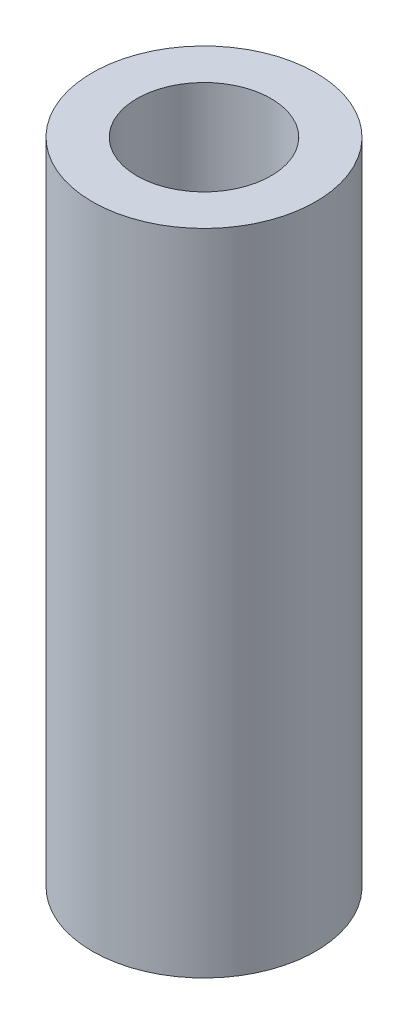
ISO-10303-21;
HEADER;
FILE_DESCRIPTION(('STEP AP214'),'2;1');
FILE_NAME('part.step','',(''),(''),'','','');
FILE_SCHEMA(('AUTOMOTIVE_DESIGN { 1 0 10303 214 1 1 1 1 }'));
ENDSEC;
DATA;
#1=APPLICATION_CONTEXT('core data for automotive mechanical design processes');
#2=APPLICATION_PROTOCOL_DEFINITION('international standard','automotive_design',2000,#1);
#3=PRODUCT_CONTEXT('',#1,'mechanical');
#4=PRODUCT('Part','Part','',(#3));
#5=PRODUCT_RELATED_PRODUCT_CATEGORY('part','',(#4));
#6=PRODUCT_DEFINITION_FORMATION('','',#4);
#7=PRODUCT_DEFINITION_CONTEXT('part definition',#1,'design');
#8=PRODUCT_DEFINITION('design','',#6,#7);
#9=PRODUCT_DEFINITION_SHAPE('','',#8);
#10=(LENGTH_UNIT() NAMED_UNIT(*) SI_UNIT(.MILLI.,.METRE.));
#11=(NAMED_UNIT(*) PLANE_ANGLE_UNIT() SI_UNIT($,.RADIAN.));
#12=(NAMED_UNIT(*) SI_UNIT($,.STERADIAN.) SOLID_ANGLE_UNIT());
#13=UNCERTAINTY_MEASURE_WITH_UNIT(LENGTH_MEASURE(1.E-05),#10,'distance_accuracy_value','');
#14=(GEOMETRIC_REPRESENTATION_CONTEXT(3) GLOBAL_UNCERTAINTY_ASSIGNED_CONTEXT((#13)) GLOBAL_UNIT_ASSIGNED_CONTEXT((#10,
#11,#12)) REPRESENTATION_CONTEXT('',''));
#15=CARTESIAN_POINT('',(0.,0.,0.));
#16=DIRECTION('',(0.,0.,1.));
#17=DIRECTION('',(1.,0.,0.));
#18=AXIS2_PLACEMENT_3D('',#15,#16,#17);
#19=CARTESIAN_POINT('',(0.,30.5,0.));
#20=DIRECTION('',(0.,-1.,0.));
#21=DIRECTION('',(0.,0.,-1.));
#22=AXIS2_PLACEMENT_3D('',#19,#20,#21);
#23=CYLINDRICAL_SURFACE('',#22,5.25);
#24=CARTESIAN_POINT('',(0.,30.5,0.));
#25=DIRECTION('',(0.,1.,0.));
#26=DIRECTION('',(0.,0.,1.));
#27=AXIS2_PLACEMENT_3D('',#24,#25,#26);
#28=CIRCLE('',#27,5.25);
#29=CARTESIAN_POINT('',(0.,30.5,-5.25));
#30=VERTEX_POINT('',#29);
#31=EDGE_CURVE('E10',#30,#30,#28,.T.);
#32=CARTESIAN_POINT('',(0.,0.,0.));
#33=DIRECTION('',(0.,1.,0.));
#34=DIRECTION('',(0.,0.,1.));
#35=AXIS2_PLACEMENT_3D('',#32,#33,#34);
#36=CIRCLE('',#35,5.25);
#37=CARTESIAN_POINT('',(0.,0.,-5.25));
#38=VERTEX_POINT('',#37);
#39=EDGE_CURVE('E44',#38,#38,#36,.T.);
#40=CARTESIAN_POINT('',(0.,30.5,-5.25));
#41=CARTESIAN_POINT('',(0.,30.1822916666667,-5.25));
#42=CARTESIAN_POINT('',(0.,29.8645833333333,-5.25));
#43=CARTESIAN_POINT('',(0.,29.2291666666667,-5.25));
#44=CARTESIAN_POINT('',(0.,28.9114583333333,-5.25));
#45=CARTESIAN_POINT('',(0.,28.2760416666667,-5.25));
#46=CARTESIAN_POINT('',(0.,27.9583333333333,-5.25));
#47=CARTESIAN_POINT('',(0.,27.3229166666667,-5.25));
#48=CARTESIAN_POINT('',(0.,27.0052083333333,-5.25));
#49=CARTESIAN_POINT('',(0.,26.3697916666667,-5.25));
#50=CARTESIAN_POINT('',(0.,26.0520833333333,-5.25));
#51=CARTESIAN_POINT('',(0.,25.4166666666667,-5.25));
#52=CARTESIAN_POINT('',(0.,25.0989583333333,-5.25));
#53=CARTESIAN_POINT('',(0.,24.4635416666667,-5.25));
#54=CARTESIAN_POINT('',(0.,24.1458333333333,-5.25));
#55=CARTESIAN_POINT('',(0.,23.5104166666667,-5.25));
#56=CARTESIAN_POINT('',(0.,23.1927083333333,-5.25));
#57=CARTESIAN_POINT('',(0.,22.5572916666667,-5.25));
#58=CARTESIAN_POINT('',(0.,22.2395833333333,-5.25));
#59=CARTESIAN_POINT('',(0.,21.6041666666667,-5.25));
#60=CARTESIAN_POINT('',(0.,21.2864583333333,-5.25));
#61=CARTESIAN_POINT('',(0.,20.6510416666667,-5.25));
#62=CARTESIAN_POINT('',(0.,20.3333333333333,-5.25));
#63=CARTESIAN_POINT('',(0.,19.6979166666667,-5.25));
#64=CARTESIAN_POINT('',(0.,19.3802083333333,-5.25));
#65=CARTESIAN_POINT('',(0.,18.7447916666667,-5.25));
#66=CARTESIAN_POINT('',(0.,18.4270833333333,-5.25));
#67=CARTESIAN_POINT('',(0.,17.7916666666667,-5.25));
#68=CARTESIAN_POINT('',(0.,17.4739583333333,-5.25));
#69=CARTESIAN_POINT('',(0.,16.8385416666667,-5.25));
#70=CARTESIAN_POINT('',(0.,16.5208333333333,-5.25));
#71=CARTESIAN_POINT('',(0.,15.8854166666667,-5.25));
#72=CARTESIAN_POINT('',(0.,15.5677083333333,-5.25));
#73=CARTESIAN_POINT('',(0.,14.9322916666667,-5.25));
#74=CARTESIAN_POINT('',(0.,14.6145833333333,-5.25));
#75=CARTESIAN_POINT('',(0.,13.9791666666667,-5.25));
#76=CARTESIAN_POINT('',(0.,13.6614583333333,-5.25));
#77=CARTESIAN_POINT('',(0.,13.0260416666667,-5.25));
#78=CARTESIAN_POINT('',(0.,12.7083333333333,-5.25));
#79=CARTESIAN_POINT('',(0.,12.0729166666667,-5.25));
#80=CARTESIAN_POINT('',(0.,11.7552083333333,-5.25));
#81=CARTESIAN_POINT('',(0.,11.1197916666667,-5.25));
#82=CARTESIAN_POINT('',(0.,10.8020833333333,-5.25));
#83=CARTESIAN_POINT('',(0.,10.1666666666667,-5.25));
#84=CARTESIAN_POINT('',(0.,9.84895833333333,-5.25));
#85=CARTESIAN_POINT('',(0.,9.21354166666666,-5.25));
#86=CARTESIAN_POINT('',(0.,8.89583333333333,-5.25));
#87=CARTESIAN_POINT('',(0.,8.26041666666666,-5.25));
#88=CARTESIAN_POINT('',(0.,7.94270833333333,-5.25));
#89=CARTESIAN_POINT('',(0.,7.30729166666666,-5.25));
#90=CARTESIAN_POINT('',(0.,6.98958333333333,-5.25));
#91=CARTESIAN_POINT('',(0.,6.35416666666666,-5.25));
#92=CARTESIAN_POINT('',(0.,6.03645833333333,-5.25));
#93=CARTESIAN_POINT('',(0.,5.40104166666666,-5.25));
#94=CARTESIAN_POINT('',(0.,5.08333333333333,-5.25));
#95=CARTESIAN_POINT('',(0.,4.44791666666666,-5.25));
#96=CARTESIAN_POINT('',(0.,4.13020833333333,-5.25));
#97=CARTESIAN_POINT('',(0.,3.49479166666666,-5.25));
#98=CARTESIAN_POINT('',(0.,3.17708333333333,-5.25));
#99=CARTESIAN_POINT('',(0.,2.54166666666666,-5.25));
#100=CARTESIAN_POINT('',(0.,2.22395833333333,-5.25));
#101=CARTESIAN_POINT('',(0.,1.58854166666666,-5.25));
#102=CARTESIAN_POINT('',(0.,1.27083333333333,-5.25));
#103=CARTESIAN_POINT('',(0.,0.635416666666662,-5.25));
#104=CARTESIAN_POINT('',(0.,0.317708333333329,-5.25));
#105=CARTESIAN_POINT('',(0.,0.,-5.25));
#106=B_SPLINE_CURVE_WITH_KNOTS('',3,(#40,#41,#42,#43,#44,#45,#46,#47,#48,#49,#50,#51,#52,#53,
#54,#55,#56,#57,#58,#59,#60,#61,#62,#63,#64,#65,#66,#67,#68,#69,#70,#71,#72,#73,#74,#75,#76,#77,
#78,#79,#80,#81,#82,#83,#84,#85,#86,#87,#88,#89,#90,#91,#92,#93,#94,#95,#96,#97,#98,#99,#100,
#101,#102,#103,#104,#105),.UNSPECIFIED.,.F.,.F.,(4,2,2,2,2,2,2,2,2,2,2,2,2,2,2,2,2,2,2,2,2,2,2,
2,2,2,2,2,2,2,2,2,4),(0.,0.953124999999999,1.90625,2.859375,3.8125,4.765625,5.71875,6.671875,
7.625,8.57812499999999,9.53125,10.484375,11.4375,12.390625,13.34375,14.296875,15.25,16.203125,
17.15625,18.109375,19.0625,20.015625,20.96875,21.921875,22.875,23.828125,24.78125,25.734375,
26.6875,27.640625,28.59375,29.546875,30.5),.UNSPECIFIED.);
#107=EDGE_CURVE('BSEAM41',#30,#38,#106,.T.);
#108=ORIENTED_EDGE('',*,*,#31,.F.);
#109=ORIENTED_EDGE('',*,*,#39,.T.);
#110=ORIENTED_EDGE('',*,*,#107,.T.);
#111=ORIENTED_EDGE('',*,*,#107,.F.);
#112=EDGE_LOOP('',(#108,#110,#109,#111));
#113=FACE_BOUND('',#112,.T.);
#114=ADVANCED_FACE('F41',(#113),#23,.T.);
#115=CARTESIAN_POINT('',(0.,30.5,0.));
#116=DIRECTION('',(0.,1.,0.));
#117=DIRECTION('',(0.,0.,1.));
#118=AXIS2_PLACEMENT_3D('',#115,#116,#117);
#119=PLANE('',#118);
#120=CARTESIAN_POINT('',(0.,30.5,0.));
#121=DIRECTION('',(0.,1.,0.));
#122=DIRECTION('',(0.,0.,1.));
#123=AXIS2_PLACEMENT_3D('',#120,#121,#122);
#124=CIRCLE('',#123,3.15);
#125=CARTESIAN_POINT('',(0.,30.5,3.15));
#126=VERTEX_POINT('',#125);
#127=EDGE_CURVE('E55',#126,#126,#124,.T.);
#128=ORIENTED_EDGE('',*,*,#127,.F.);
#129=EDGE_LOOP('',(#128));
#130=FACE_BOUND('',#129,.T.);
#131=ORIENTED_EDGE('',*,*,#31,.T.);
#132=EDGE_LOOP('',(#131));
#133=FACE_BOUND('',#132,.T.);
#134=ADVANCED_FACE('F72',(#130,#133),#119,.T.);
#135=CARTESIAN_POINT('',(0.,0.,0.));
#136=DIRECTION('',(0.,1.,0.));
#137=DIRECTION('',(0.,0.,1.));
#138=AXIS2_PLACEMENT_3D('',#135,#136,#137);
#139=PLANE('',#138);
#140=CARTESIAN_POINT('',(0.,0.,0.));
#141=DIRECTION('',(0.,1.,0.));
#142=DIRECTION('',(0.,0.,1.));
#143=AXIS2_PLACEMENT_3D('',#140,#141,#142);
#144=CIRCLE('',#143,3.15);
#145=CARTESIAN_POINT('',(0.,0.,3.15));
#146=VERTEX_POINT('',#145);
#147=EDGE_CURVE('E53',#146,#146,#144,.T.);
#148=ORIENTED_EDGE('',*,*,#147,.T.);
#149=EDGE_LOOP('',(#148));
#150=FACE_BOUND('',#149,.T.);
#151=ORIENTED_EDGE('',*,*,#39,.F.);
#152=EDGE_LOOP('',(#151));
#153=FACE_BOUND('',#152,.T.);
#154=ADVANCED_FACE('F63',(#150,#153),#139,.F.);
#155=CARTESIAN_POINT('',(0.,0.,0.));
#156=DIRECTION('',(0.,1.,0.));
#157=DIRECTION('',(0.,0.,1.));
#158=AXIS2_PLACEMENT_3D('',#155,#156,#157);
#159=CYLINDRICAL_SURFACE('',#158,3.15);
#160=CARTESIAN_POINT('',(0.,0.,3.15));
#161=CARTESIAN_POINT('',(0.,0.317708333333333,3.15));
#162=CARTESIAN_POINT('',(0.,0.635416666666667,3.15));
#163=CARTESIAN_POINT('',(0.,1.27083333333333,3.15));
#164=CARTESIAN_POINT('',(0.,1.58854166666667,3.15));
#165=CARTESIAN_POINT('',(0.,2.22395833333333,3.15));
#166=CARTESIAN_POINT('',(0.,2.54166666666667,3.15));
#167=CARTESIAN_POINT('',(0.,3.17708333333333,3.15));
#168=CARTESIAN_POINT('',(0.,3.49479166666667,3.15));
#169=CARTESIAN_POINT('',(0.,4.13020833333333,3.15));
#170=CARTESIAN_POINT('',(0.,4.44791666666667,3.15));
#171=CARTESIAN_POINT('',(0.,5.08333333333333,3.15));
#172=CARTESIAN_POINT('',(0.,5.40104166666667,3.15));
#173=CARTESIAN_POINT('',(0.,6.03645833333333,3.15));
#174=CARTESIAN_POINT('',(0.,6.35416666666667,3.15));
#175=CARTESIAN_POINT('',(0.,6.98958333333333,3.15));
#176=CARTESIAN_POINT('',(0.,7.30729166666667,3.15));
#177=CARTESIAN_POINT('',(0.,7.94270833333333,3.15));
#178=CARTESIAN_POINT('',(0.,8.26041666666666,3.15));
#179=CARTESIAN_POINT('',(0.,8.89583333333333,3.15));
#180=CARTESIAN_POINT('',(0.,9.21354166666666,3.15));
#181=CARTESIAN_POINT('',(0.,9.84895833333333,3.15));
#182=CARTESIAN_POINT('',(0.,10.1666666666667,3.15));
#183=CARTESIAN_POINT('',(0.,10.8020833333333,3.15));
#184=CARTESIAN_POINT('',(0.,11.1197916666667,3.15));
#185=CARTESIAN_POINT('',(0.,11.7552083333333,3.15));
#186=CARTESIAN_POINT('',(0.,12.0729166666667,3.15));
#187=CARTESIAN_POINT('',(0.,12.7083333333333,3.15));
#188=CARTESIAN_POINT('',(0.,13.0260416666667,3.15));
#189=CARTESIAN_POINT('',(0.,13.6614583333333,3.15));
#190=CARTESIAN_POINT('',(0.,13.9791666666667,3.15));
#191=CARTESIAN_POINT('',(0.,14.6145833333333,3.15));
#192=CARTESIAN_POINT('',(0.,14.9322916666667,3.15));
#193=CARTESIAN_POINT('',(0.,15.5677083333333,3.15));
#194=CARTESIAN_POINT('',(0.,15.8854166666667,3.15));
#195=CARTESIAN_POINT('',(0.,16.5208333333333,3.15));
#196=CARTESIAN_POINT('',(0.,16.8385416666667,3.15));
#197=CARTESIAN_POINT('',(0.,17.4739583333333,3.15));
#198=CARTESIAN_POINT('',(0.,17.7916666666667,3.15));
#199=CARTESIAN_POINT('',(0.,18.4270833333333,3.15));
#200=CARTESIAN_POINT('',(0.,18.7447916666667,3.15));
#201=CARTESIAN_POINT('',(0.,19.3802083333333,3.15));
#202=CARTESIAN_POINT('',(0.,19.6979166666667,3.15));
#203=CARTESIAN_POINT('',(0.,20.3333333333333,3.15));
#204=CARTESIAN_POINT('',(0.,20.6510416666667,3.15));
#205=CARTESIAN_POINT('',(0.,21.2864583333333,3.15));
#206=CARTESIAN_POINT('',(0.,21.6041666666667,3.15));
#207=CARTESIAN_POINT('',(0.,22.2395833333333,3.15));
#208=CARTESIAN_POINT('',(0.,22.5572916666667,3.15));
#209=CARTESIAN_POINT('',(0.,23.1927083333333,3.15));
#210=CARTESIAN_POINT('',(0.,23.5104166666667,3.15));
#211=CARTESIAN_POINT('',(0.,24.1458333333333,3.15));
#212=CARTESIAN_POINT('',(0.,24.4635416666667,3.15));
#213=CARTESIAN_POINT('',(0.,25.0989583333333,3.15));
#214=CARTESIAN_POINT('',(0.,25.4166666666667,3.15));
#215=CARTESIAN_POINT('',(0.,26.0520833333333,3.15));
#216=CARTESIAN_POINT('',(0.,26.3697916666667,3.15));
#217=CARTESIAN_POINT('',(0.,27.0052083333333,3.15));
#218=CARTESIAN_POINT('',(0.,27.3229166666667,3.15));
#219=CARTESIAN_POINT('',(0.,27.9583333333333,3.15));
#220=CARTESIAN_POINT('',(0.,28.2760416666667,3.15));
#221=CARTESIAN_POINT('',(0.,28.9114583333333,3.15));
#222=CARTESIAN_POINT('',(0.,29.2291666666667,3.15));
#223=CARTESIAN_POINT('',(0.,29.8645833333333,3.15));
#224=CARTESIAN_POINT('',(0.,30.1822916666667,3.15));
#225=CARTESIAN_POINT('',(0.,30.5,3.15));
#226=B_SPLINE_CURVE_WITH_KNOTS('',3,(#160,#161,#162,#163,#164,#165,#166,#167,#168,#169,#170,
#171,#172,#173,#174,#175,#176,#177,#178,#179,#180,#181,#182,#183,#184,#185,#186,#187,#188,#189,
#190,#191,#192,#193,#194,#195,#196,#197,#198,#199,#200,#201,#202,#203,#204,#205,#206,#207,#208,
#209,#210,#211,#212,#213,#214,#215,#216,#217,#218,#219,#220,#221,#222,#223,#224,#225),
.UNSPECIFIED.,.F.,.F.,(4,2,2,2,2,2,2,2,2,2,2,2,2,2,2,2,2,2,2,2,2,2,2,2,2,2,2,2,2,2,2,2,4),(0.,
0.953125,1.90625,2.859375,3.8125,4.765625,5.71875,6.671875,7.625,8.578125,9.53125,10.484375,
11.4375,12.390625,13.34375,14.296875,15.25,16.203125,17.15625,18.109375,19.0625,20.015625,
20.96875,21.921875,22.875,23.828125,24.78125,25.734375,26.6875,27.640625,28.59375,29.546875,
30.5),.UNSPECIFIED.);
#227=EDGE_CURVE('BSEAM66',#146,#126,#226,.T.);
#228=ORIENTED_EDGE('',*,*,#147,.F.);
#229=ORIENTED_EDGE('',*,*,#127,.T.);
#230=ORIENTED_EDGE('',*,*,#227,.T.);
#231=ORIENTED_EDGE('',*,*,#227,.F.);
#232=EDGE_LOOP('',(#228,#230,#229,#231));
#233=FACE_BOUND('',#232,.T.);
#234=ADVANCED_FACE('F66',(#233),#159,.F.);
#235=CLOSED_SHELL('',(#114,#134,#154,#234));
#236=MANIFOLD_SOLID_BREP('B2',#235);
#237=ADVANCED_BREP_SHAPE_REPRESENTATION('',(#18,#236),#14);
#238=SHAPE_DEFINITION_REPRESENTATION(#9,#237);
ENDSEC;
END-ISO-10303-21;
